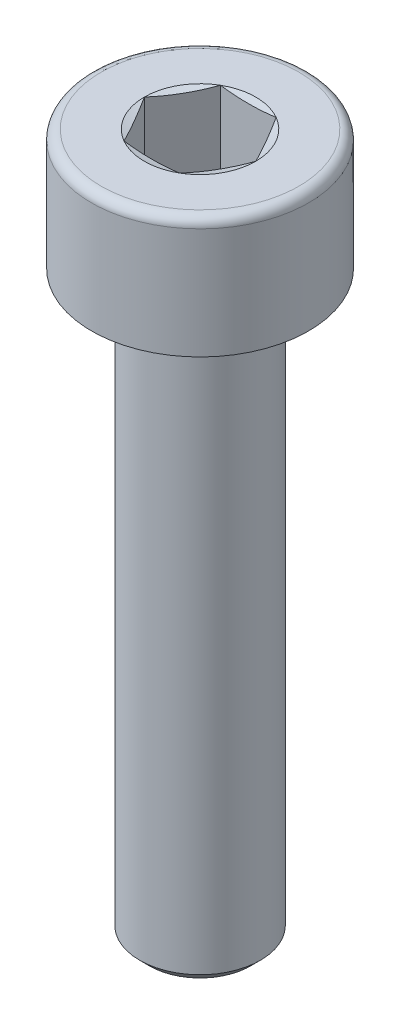
ISO-10303-21;
HEADER;
FILE_DESCRIPTION(('STEP AP214'),'2;1');
FILE_NAME('part.step','',(''),(''),'','','');
FILE_SCHEMA(('AUTOMOTIVE_DESIGN { 1 0 10303 214 1 1 1 1 }'));
ENDSEC;
DATA;
#1=APPLICATION_CONTEXT('core data for automotive mechanical design processes');
#2=APPLICATION_PROTOCOL_DEFINITION('international standard','automotive_design',2000,#1);
#3=PRODUCT_CONTEXT('',#1,'mechanical');
#4=PRODUCT('Part','Part','',(#3));
#5=PRODUCT_RELATED_PRODUCT_CATEGORY('part','',(#4));
#6=PRODUCT_DEFINITION_FORMATION('','',#4);
#7=PRODUCT_DEFINITION_CONTEXT('part definition',#1,'design');
#8=PRODUCT_DEFINITION('design','',#6,#7);
#9=PRODUCT_DEFINITION_SHAPE('','',#8);
#10=(LENGTH_UNIT() NAMED_UNIT(*) SI_UNIT(.MILLI.,.METRE.));
#11=(NAMED_UNIT(*) PLANE_ANGLE_UNIT() SI_UNIT($,.RADIAN.));
#12=(NAMED_UNIT(*) SI_UNIT($,.STERADIAN.) SOLID_ANGLE_UNIT());
#13=UNCERTAINTY_MEASURE_WITH_UNIT(LENGTH_MEASURE(1.E-05),#10,'distance_accuracy_value','');
#14=(GEOMETRIC_REPRESENTATION_CONTEXT(3) GLOBAL_UNCERTAINTY_ASSIGNED_CONTEXT((#13)) GLOBAL_UNIT_ASSIGNED_CONTEXT((#10,
#11,#12)) REPRESENTATION_CONTEXT('',''));
#15=CARTESIAN_POINT('',(0.,0.,0.));
#16=DIRECTION('',(0.,0.,1.));
#17=DIRECTION('',(1.,0.,0.));
#18=AXIS2_PLACEMENT_3D('',#15,#16,#17);
#19=CARTESIAN_POINT('',(-0.577350269189626,0.5,1.));
#20=DIRECTION('',(-0.866025403784439,0.,0.5));
#21=DIRECTION('',(0.5,0.,0.866025403784439));
#22=AXIS2_PLACEMENT_3D('',#19,#20,#21);
#23=PLANE('',#22);
#24=CARTESIAN_POINT('',(-0.577350269189626,2.5,1.));
#25=CARTESIAN_POINT('',(-0.602256905546369,2.4928156948734,0.956860440384478));
#26=CARTESIAN_POINT('',(-0.627233209396661,2.48665993251672,0.913600213130495));
#27=CARTESIAN_POINT('',(-0.677282869012062,2.47629629733561,0.826911659775093));
#28=CARTESIAN_POINT('',(-0.702356208114864,2.47208810385436,0.783483362533635));
#29=CARTESIAN_POINT('',(-0.777414647875531,2.46225168137474,0.653478331331313));
#30=CARTESIAN_POINT('',(-0.827492964204296,2.45934068378329,0.566740143092385));
#31=CARTESIAN_POINT('',(-0.923802752789168,2.46037348534467,0.399926695997169));
#32=CARTESIAN_POINT('',(-0.970035820593887,2.46381057241938,0.319848673569621));
#33=CARTESIAN_POINT('',(-1.03932177179707,2.47367744547349,0.199841885834972));
#34=CARTESIAN_POINT('',(-1.0624605054686,2.47776673103799,0.159764423493069));
#35=CARTESIAN_POINT('',(-1.10865304075022,2.48761182938245,0.079756605454884));
#36=CARTESIAN_POINT('',(-1.13170682656885,2.49336793760975,0.039826277110207));
#37=CARTESIAN_POINT('',(-1.15470053837925,2.5,0.));
#38=B_SPLINE_CURVE_WITH_KNOTS('',3,(#24,#25,#26,#27,#28,#29,#30,#31,#32,#33,#34,#35,#36,#37),
.UNSPECIFIED.,.F.,.F.,(4,2,2,2,2,2,4),(0.,0.150960283418929,0.3018957031821,0.602226966634645,
0.879613062899962,1.01895925678016,1.15833016516169),.UNSPECIFIED.);
#39=CARTESIAN_POINT('',(-0.577350269189627,2.5,0.999999999999999));
#40=VERTEX_POINT('',#39);
#41=CARTESIAN_POINT('',(-1.15470053837925,2.5,0.));
#42=VERTEX_POINT('',#41);
#43=EDGE_CURVE('E81',#40,#42,#38,.T.);
#44=ORIENTED_EDGE('',*,*,#43,.F.);
#45=DIRECTION('',(0.,1.,0.));
#46=VECTOR('',#45,1.);
#47=CARTESIAN_POINT('',(-0.577350269189626,0.5,1.));
#48=LINE('',#47,#46);
#49=CARTESIAN_POINT('',(-0.577350269189626,0.5,1.));
#50=VERTEX_POINT('',#49);
#51=EDGE_CURVE('E117',#40,#50,#48,.F.);
#52=ORIENTED_EDGE('',*,*,#51,.T.);
#53=DIRECTION('',(0.5,0.,0.866025403784439));
#54=VECTOR('',#53,1.);
#55=CARTESIAN_POINT('',(-0.577350269189626,0.5,1.));
#56=LINE('',#55,#54);
#57=CARTESIAN_POINT('',(-1.15470053837925,0.5,0.));
#58=VERTEX_POINT('',#57);
#59=EDGE_CURVE('E90',#58,#50,#56,.T.);
#60=ORIENTED_EDGE('',*,*,#59,.F.);
#61=DIRECTION('',(0.,1.,0.));
#62=VECTOR('',#61,1.);
#63=CARTESIAN_POINT('',(-1.15470053837925,0.5,0.));
#64=LINE('',#63,#62);
#65=EDGE_CURVE('E89',#58,#42,#64,.T.);
#66=ORIENTED_EDGE('',*,*,#65,.T.);
#67=EDGE_LOOP('',(#44,#52,#60,#66));
#68=FACE_BOUND('',#67,.T.);
#69=ADVANCED_FACE('F17',(#68),#23,.F.);
#70=CARTESIAN_POINT('',(-1.15470053837925,0.5,0.));
#71=DIRECTION('',(-0.866025403784439,0.,-0.5));
#72=DIRECTION('',(-0.5,0.,0.866025403784439));
#73=AXIS2_PLACEMENT_3D('',#70,#71,#72);
#74=PLANE('',#73);
#75=CARTESIAN_POINT('',(-1.15470053837925,2.5,0.));
#76=CARTESIAN_POINT('',(-1.12979390202251,2.4928156948734,-0.0431395596155219));
#77=CARTESIAN_POINT('',(-1.10481759817222,2.48665993251672,-0.0863997868695049));
#78=CARTESIAN_POINT('',(-1.05476793855682,2.47629629733561,-0.173088340224907));
#79=CARTESIAN_POINT('',(-1.02969459945401,2.47208810385436,-0.216516637466365));
#80=CARTESIAN_POINT('',(-0.954636159693347,2.46225168137474,-0.346521668668687));
#81=CARTESIAN_POINT('',(-0.904557843364581,2.45934068378329,-0.433259856907615));
#82=CARTESIAN_POINT('',(-0.808248054779709,2.46037348534467,-0.600073304002831));
#83=CARTESIAN_POINT('',(-0.762014986974991,2.46381057241938,-0.68015132643038));
#84=CARTESIAN_POINT('',(-0.692729035771809,2.47367744547349,-0.800158114165029));
#85=CARTESIAN_POINT('',(-0.669590302100274,2.47776673103799,-0.840235576506932));
#86=CARTESIAN_POINT('',(-0.623397766818654,2.48761182938245,-0.920243394545117));
#87=CARTESIAN_POINT('',(-0.600343981000024,2.49336793760975,-0.960173722889794));
#88=CARTESIAN_POINT('',(-0.577350269189626,2.5,-1.));
#89=B_SPLINE_CURVE_WITH_KNOTS('',3,(#75,#76,#77,#78,#79,#80,#81,#82,#83,#84,#85,#86,#87,#88),
.UNSPECIFIED.,.F.,.F.,(4,2,2,2,2,2,4),(0.,0.150960283418929,0.3018957031821,0.602226966634645,
0.879613062899963,1.01895925678016,1.15833016516169),.UNSPECIFIED.);
#90=CARTESIAN_POINT('',(-0.577350269189624,2.5,-1.));
#91=VERTEX_POINT('',#90);
#92=EDGE_CURVE('E96',#42,#91,#89,.T.);
#93=ORIENTED_EDGE('',*,*,#92,.F.);
#94=ORIENTED_EDGE('',*,*,#65,.F.);
#95=DIRECTION('',(0.5,0.,-0.866025403784439));
#96=VECTOR('',#95,1.);
#97=CARTESIAN_POINT('',(-1.15470053837925,0.5,0.));
#98=LINE('',#97,#96);
#99=CARTESIAN_POINT('',(-0.577350269189626,0.5,-1.));
#100=VERTEX_POINT('',#99);
#101=EDGE_CURVE('E228',#58,#100,#98,.T.);
#102=ORIENTED_EDGE('',*,*,#101,.T.);
#103=DIRECTION('',(0.,1.,0.));
#104=VECTOR('',#103,1.);
#105=CARTESIAN_POINT('',(-0.577350269189626,0.5,-1.));
#106=LINE('',#105,#104);
#107=EDGE_CURVE('E115',#100,#91,#106,.T.);
#108=ORIENTED_EDGE('',*,*,#107,.T.);
#109=EDGE_LOOP('',(#93,#94,#102,#108));
#110=FACE_BOUND('',#109,.T.);
#111=ADVANCED_FACE('F113',(#110),#74,.F.);
#112=CARTESIAN_POINT('',(0.577350269189626,0.5,1.));
#113=DIRECTION('',(0.,0.,1.));
#114=DIRECTION('',(1.,0.,0.));
#115=AXIS2_PLACEMENT_3D('',#112,#113,#114);
#116=PLANE('',#115);
#117=CARTESIAN_POINT('',(0.577350269189626,2.5,0.999999999999999));
#118=CARTESIAN_POINT('',(0.527536996476139,2.4928156948734,1.));
#119=CARTESIAN_POINT('',(0.477584388775556,2.48665993251672,1.));
#120=CARTESIAN_POINT('',(0.377485069544755,2.47629629733561,1.));
#121=CARTESIAN_POINT('',(0.327338391339149,2.47208810385436,1.));
#122=CARTESIAN_POINT('',(0.177221511817816,2.46225168137474,1.));
#123=CARTESIAN_POINT('',(0.0770648791602852,2.45934068378329,1.));
#124=CARTESIAN_POINT('',(-0.115554698009459,2.46037348534467,1.));
#125=CARTESIAN_POINT('',(-0.208020833618895,2.46381057241938,1.));
#126=CARTESIAN_POINT('',(-0.346592736025259,2.47367744547349,1.));
#127=CARTESIAN_POINT('',(-0.39287020336833,2.47776673103799,1.));
#128=CARTESIAN_POINT('',(-0.485255273931571,2.48761182938245,1.));
#129=CARTESIAN_POINT('',(-0.53136284556883,2.49336793760975,1.));
#130=CARTESIAN_POINT('',(-0.577350269189626,2.5,1.));
#131=B_SPLINE_CURVE_WITH_KNOTS('',3,(#117,#118,#119,#120,#121,#122,#123,#124,#125,#126,#127,
#128,#129,#130),.UNSPECIFIED.,.F.,.F.,(4,2,2,2,2,2,4),(0.,0.150960283418929,0.3018957031821,
0.602226966634645,0.879613062899963,1.01895925678016,1.15833016516169),.UNSPECIFIED.);
#132=CARTESIAN_POINT('',(0.577350269189624,2.5,1.));
#133=VERTEX_POINT('',#132);
#134=EDGE_CURVE('E75',#133,#40,#131,.T.);
#135=ORIENTED_EDGE('',*,*,#134,.F.);
#136=DIRECTION('',(0.,1.,0.));
#137=VECTOR('',#136,1.);
#138=CARTESIAN_POINT('',(0.577350269189626,0.5,1.));
#139=LINE('',#138,#137);
#140=CARTESIAN_POINT('',(0.577350269189626,0.5,1.));
#141=VERTEX_POINT('',#140);
#142=EDGE_CURVE('E211',#133,#141,#139,.F.);
#143=ORIENTED_EDGE('',*,*,#142,.T.);
#144=DIRECTION('',(1.,0.,0.));
#145=VECTOR('',#144,1.);
#146=CARTESIAN_POINT('',(-0.577350269189626,0.5,1.));
#147=LINE('',#146,#145);
#148=EDGE_CURVE('E232',#141,#50,#147,.F.);
#149=ORIENTED_EDGE('',*,*,#148,.T.);
#150=ORIENTED_EDGE('',*,*,#51,.F.);
#151=EDGE_LOOP('',(#135,#143,#149,#150));
#152=FACE_BOUND('',#151,.T.);
#153=ADVANCED_FACE('F138',(#152),#116,.F.);
#154=CARTESIAN_POINT('',(-0.577350269189626,0.5,-1.));
#155=DIRECTION('',(0.,-1.,0.));
#156=DIRECTION('',(0.,0.,-1.));
#157=AXIS2_PLACEMENT_3D('',#154,#155,#156);
#158=PLANE('',#157);
#159=ORIENTED_EDGE('',*,*,#59,.T.);
#160=ORIENTED_EDGE('',*,*,#148,.F.);
#161=DIRECTION('',(0.5,0.,-0.866025403784439));
#162=VECTOR('',#161,1.);
#163=CARTESIAN_POINT('',(1.15470053837925,0.5,0.));
#164=LINE('',#163,#162);
#165=CARTESIAN_POINT('',(1.15470053837925,0.5,0.));
#166=VERTEX_POINT('',#165);
#167=EDGE_CURVE('E160',#141,#166,#164,.T.);
#168=ORIENTED_EDGE('',*,*,#167,.T.);
#169=DIRECTION('',(-0.5,0.,-0.866025403784439));
#170=VECTOR('',#169,1.);
#171=CARTESIAN_POINT('',(0.577350269189626,0.5,-1.));
#172=LINE('',#171,#170);
#173=CARTESIAN_POINT('',(0.577350269189626,0.5,-1.));
#174=VERTEX_POINT('',#173);
#175=EDGE_CURVE('E208',#166,#174,#172,.T.);
#176=ORIENTED_EDGE('',*,*,#175,.T.);
#177=DIRECTION('',(-1.,0.,0.));
#178=VECTOR('',#177,1.);
#179=CARTESIAN_POINT('',(-0.577350269189626,0.5,-1.));
#180=LINE('',#179,#178);
#181=EDGE_CURVE('E223',#174,#100,#180,.T.);
#182=ORIENTED_EDGE('',*,*,#181,.T.);
#183=ORIENTED_EDGE('',*,*,#101,.F.);
#184=EDGE_LOOP('',(#159,#160,#168,#176,#182,#183));
#185=FACE_BOUND('',#184,.T.);
#186=ADVANCED_FACE('F142',(#185),#158,.F.);
#187=CARTESIAN_POINT('',(-0.577350269189626,0.5,-1.));
#188=DIRECTION('',(0.,0.,-1.));
#189=DIRECTION('',(-1.,0.,0.));
#190=AXIS2_PLACEMENT_3D('',#187,#188,#189);
#191=PLANE('',#190);
#192=CARTESIAN_POINT('',(-0.577350269189626,2.5,-1.));
#193=CARTESIAN_POINT('',(-0.527536996476139,2.4928156948734,-1.));
#194=CARTESIAN_POINT('',(-0.477584388775556,2.48665993251672,-1.));
#195=CARTESIAN_POINT('',(-0.377485069544755,2.47629629733561,-1.));
#196=CARTESIAN_POINT('',(-0.327338391339149,2.47208810385436,-1.));
#197=CARTESIAN_POINT('',(-0.177221511817817,2.46225168137474,-1.));
#198=CARTESIAN_POINT('',(-0.0770648791602854,2.45934068378329,-1.));
#199=CARTESIAN_POINT('',(0.115554698009459,2.46037348534467,-1.));
#200=CARTESIAN_POINT('',(0.208020833618895,2.46381057241938,-1.));
#201=CARTESIAN_POINT('',(0.346592736025259,2.47367744547349,-1.));
#202=CARTESIAN_POINT('',(0.39287020336833,2.47776673103799,-1.));
#203=CARTESIAN_POINT('',(0.485255273931571,2.48761182938245,-1.));
#204=CARTESIAN_POINT('',(0.53136284556883,2.49336793760975,-1.));
#205=CARTESIAN_POINT('',(0.577350269189627,2.5,-1.));
#206=B_SPLINE_CURVE_WITH_KNOTS('',3,(#192,#193,#194,#195,#196,#197,#198,#199,#200,#201,#202,
#203,#204,#205),.UNSPECIFIED.,.F.,.F.,(4,2,2,2,2,2,4),(0.,0.150960283418929,0.301895703182099,
0.602226966634645,0.879613062899963,1.01895925678016,1.15833016516169),.UNSPECIFIED.);
#207=CARTESIAN_POINT('',(0.577350269189626,2.5,-0.999999999999999));
#208=VERTEX_POINT('',#207);
#209=EDGE_CURVE('E155',#91,#208,#206,.T.);
#210=ORIENTED_EDGE('',*,*,#209,.F.);
#211=ORIENTED_EDGE('',*,*,#107,.F.);
#212=ORIENTED_EDGE('',*,*,#181,.F.);
#213=DIRECTION('',(0.,1.,0.));
#214=VECTOR('',#213,1.);
#215=CARTESIAN_POINT('',(0.577350269189626,0.5,-1.));
#216=LINE('',#215,#214);
#217=EDGE_CURVE('E203',#174,#208,#216,.T.);
#218=ORIENTED_EDGE('',*,*,#217,.T.);
#219=EDGE_LOOP('',(#210,#211,#212,#218));
#220=FACE_BOUND('',#219,.T.);
#221=ADVANCED_FACE('F146',(#220),#191,.F.);
#222=CARTESIAN_POINT('',(1.15470053837925,0.5,0.));
#223=DIRECTION('',(0.866025403784439,0.,0.5));
#224=DIRECTION('',(0.5,0.,-0.866025403784439));
#225=AXIS2_PLACEMENT_3D('',#222,#223,#224);
#226=PLANE('',#225);
#227=CARTESIAN_POINT('',(1.15470053837925,2.5,0.));
#228=CARTESIAN_POINT('',(1.12979390202251,2.4928156948734,0.043139559615522));
#229=CARTESIAN_POINT('',(1.10481759817222,2.48665993251672,0.0863997868695051));
#230=CARTESIAN_POINT('',(1.05476793855682,2.47629629733561,0.173088340224907));
#231=CARTESIAN_POINT('',(1.02969459945401,2.47208810385436,0.216516637466365));
#232=CARTESIAN_POINT('',(0.954636159693347,2.46225168137474,0.346521668668687));
#233=CARTESIAN_POINT('',(0.904557843364581,2.45934068378329,0.433259856907615));
#234=CARTESIAN_POINT('',(0.808248054779709,2.46037348534467,0.600073304002831));
#235=CARTESIAN_POINT('',(0.762014986974991,2.46381057241938,0.680151326430379));
#236=CARTESIAN_POINT('',(0.692729035771809,2.47367744547349,0.800158114165028));
#237=CARTESIAN_POINT('',(0.669590302100274,2.47776673103799,0.840235576506932));
#238=CARTESIAN_POINT('',(0.623397766818654,2.48761182938245,0.920243394545116));
#239=CARTESIAN_POINT('',(0.600343981000024,2.49336793760975,0.960173722889794));
#240=CARTESIAN_POINT('',(0.577350269189626,2.5,1.));
#241=B_SPLINE_CURVE_WITH_KNOTS('',3,(#227,#228,#229,#230,#231,#232,#233,#234,#235,#236,#237,
#238,#239,#240),.UNSPECIFIED.,.F.,.F.,(4,2,2,2,2,2,4),(0.,0.150960283418929,0.3018957031821,
0.602226966634645,0.879613062899962,1.01895925678016,1.15833016516169),.UNSPECIFIED.);
#242=CARTESIAN_POINT('',(1.15470053837925,2.5,0.));
#243=VERTEX_POINT('',#242);
#244=EDGE_CURVE('E161',#243,#133,#241,.T.);
#245=ORIENTED_EDGE('',*,*,#244,.F.);
#246=DIRECTION('',(0.,1.,0.));
#247=VECTOR('',#246,1.);
#248=CARTESIAN_POINT('',(1.15470053837925,0.5,0.));
#249=LINE('',#248,#247);
#250=EDGE_CURVE('E199',#243,#166,#249,.F.);
#251=ORIENTED_EDGE('',*,*,#250,.T.);
#252=ORIENTED_EDGE('',*,*,#167,.F.);
#253=ORIENTED_EDGE('',*,*,#142,.F.);
#254=EDGE_LOOP('',(#245,#251,#252,#253));
#255=FACE_BOUND('',#254,.T.);
#256=ADVANCED_FACE('F151',(#255),#226,.F.);
#257=CARTESIAN_POINT('',(0.577350269189626,0.5,-1.));
#258=DIRECTION('',(0.866025403784439,0.,-0.5));
#259=DIRECTION('',(-0.5,0.,-0.866025403784439));
#260=AXIS2_PLACEMENT_3D('',#257,#258,#259);
#261=PLANE('',#260);
#262=CARTESIAN_POINT('',(1.15470053837925,2.5,0.));
#263=CARTESIAN_POINT('',(1.12979390202251,2.4928156948734,-0.0431395596155215));
#264=CARTESIAN_POINT('',(1.10481759817222,2.48665993251672,-0.0863997868695045));
#265=CARTESIAN_POINT('',(1.05476793855682,2.47629629733561,-0.173088340224907));
#266=CARTESIAN_POINT('',(1.02969459945401,2.47208810385436,-0.216516637466365));
#267=CARTESIAN_POINT('',(0.954636159693347,2.46225168137474,-0.346521668668687));
#268=CARTESIAN_POINT('',(0.904557843364581,2.45934068378329,-0.433259856907614));
#269=CARTESIAN_POINT('',(0.808248054779709,2.46037348534467,-0.60007330400283));
#270=CARTESIAN_POINT('',(0.762014986974991,2.46381057241937,-0.680151326430379));
#271=CARTESIAN_POINT('',(0.69272903577181,2.47367744547348,-0.800158114165028));
#272=CARTESIAN_POINT('',(0.669590302100275,2.47776673103799,-0.840235576506931));
#273=CARTESIAN_POINT('',(0.623397766818654,2.48761182938245,-0.920243394545116));
#274=CARTESIAN_POINT('',(0.600343981000025,2.49336793760975,-0.960173722889793));
#275=CARTESIAN_POINT('',(0.577350269189626,2.5,-0.999999999999999));
#276=B_SPLINE_CURVE_WITH_KNOTS('',3,(#262,#263,#264,#265,#266,#267,#268,#269,#270,#271,#272,
#273,#274,#275),.UNSPECIFIED.,.F.,.F.,(4,2,2,2,2,2,4),(0.,0.150960283418929,0.3018957031821,
0.602226966634646,0.879613062899962,1.01895925678016,1.15833016516169),.UNSPECIFIED.);
#277=EDGE_CURVE('E202',#243,#208,#276,.T.);
#278=ORIENTED_EDGE('',*,*,#277,.T.);
#279=ORIENTED_EDGE('',*,*,#217,.F.);
#280=ORIENTED_EDGE('',*,*,#175,.F.);
#281=ORIENTED_EDGE('',*,*,#250,.F.);
#282=EDGE_LOOP('',(#278,#279,#280,#281));
#283=FACE_BOUND('',#282,.T.);
#284=ADVANCED_FACE('F194',(#283),#261,.F.);
#285=CARTESIAN_POINT('',(-0.323386652483568,5.38251924939228,0.));
#286=DIRECTION('',(0.,0.,1.));
#287=DIRECTION('',(-1.,0.,0.));
#288=AXIS2_PLACEMENT_3D('',#285,#286,#287);
#289=CIRCLE('',#288,3.);
#290=TRIMMED_CURVE('',#289,(PARAMETER_VALUE(-1.67880173874616)),
(PARAMETER_VALUE(1.67880173874616)),.T.,.PARAMETER.);
#291=CARTESIAN_POINT('',(0.,5.38251924939228,0.));
#292=DIRECTION('',(0.,1.,0.));
#293=AXIS1_PLACEMENT('',#291,#292);
#294=SURFACE_OF_REVOLUTION('',#290,#293);
#295=ORIENTED_EDGE('',*,*,#244,.T.);
#296=CARTESIAN_POINT('',(0.,2.5,0.));
#297=DIRECTION('',(0.,1.,0.));
#298=DIRECTION('',(-1.,0.,0.));
#299=AXIS2_PLACEMENT_3D('',#296,#297,#298);
#300=CIRCLE('',#299,1.15470053837925);
#301=EDGE_CURVE('E259',#243,#133,#300,.F.);
#302=ORIENTED_EDGE('',*,*,#301,.F.);
#303=EDGE_LOOP('',(#295,#302));
#304=FACE_BOUND('',#303,.T.);
#305=ADVANCED_FACE('F191',(#304),#294,.T.);
#306=CARTESIAN_POINT('',(-0.323386652483568,5.38251924939228,0.));
#307=DIRECTION('',(0.,0.,1.));
#308=DIRECTION('',(-1.,0.,0.));
#309=AXIS2_PLACEMENT_3D('',#306,#307,#308);
#310=CIRCLE('',#309,3.);
#311=TRIMMED_CURVE('',#310,(PARAMETER_VALUE(-1.67880173874616)),
(PARAMETER_VALUE(1.67880173874616)),.T.,.PARAMETER.);
#312=CARTESIAN_POINT('',(0.,5.38251924939228,0.));
#313=DIRECTION('',(0.,1.,0.));
#314=AXIS1_PLACEMENT('',#312,#313);
#315=SURFACE_OF_REVOLUTION('',#311,#314);
#316=ORIENTED_EDGE('',*,*,#134,.T.);
#317=CARTESIAN_POINT('',(0.,2.5,0.));
#318=DIRECTION('',(0.,1.,0.));
#319=DIRECTION('',(-1.,0.,0.));
#320=AXIS2_PLACEMENT_3D('',#317,#318,#319);
#321=CIRCLE('',#320,1.15470053837925);
#322=EDGE_CURVE('E106',#133,#40,#321,.F.);
#323=ORIENTED_EDGE('',*,*,#322,.F.);
#324=EDGE_LOOP('',(#316,#323));
#325=FACE_BOUND('',#324,.T.);
#326=ADVANCED_FACE('F188',(#325),#315,.T.);
#327=CARTESIAN_POINT('',(-0.323386652483568,5.38251924939228,0.));
#328=DIRECTION('',(0.,0.,1.));
#329=DIRECTION('',(-1.,0.,0.));
#330=AXIS2_PLACEMENT_3D('',#327,#328,#329);
#331=CIRCLE('',#330,3.);
#332=TRIMMED_CURVE('',#331,(PARAMETER_VALUE(-1.67880173874616)),
(PARAMETER_VALUE(1.67880173874616)),.T.,.PARAMETER.);
#333=CARTESIAN_POINT('',(0.,5.38251924939228,0.));
#334=DIRECTION('',(0.,1.,0.));
#335=AXIS1_PLACEMENT('',#333,#334);
#336=SURFACE_OF_REVOLUTION('',#332,#335);
#337=ORIENTED_EDGE('',*,*,#43,.T.);
#338=CARTESIAN_POINT('',(0.,2.5,0.));
#339=DIRECTION('',(0.,1.,0.));
#340=DIRECTION('',(-1.,0.,0.));
#341=AXIS2_PLACEMENT_3D('',#338,#339,#340);
#342=CIRCLE('',#341,1.15470053837925);
#343=EDGE_CURVE('E85',#40,#42,#342,.F.);
#344=ORIENTED_EDGE('',*,*,#343,.F.);
#345=EDGE_LOOP('',(#337,#344));
#346=FACE_BOUND('',#345,.T.);
#347=ADVANCED_FACE('F83',(#346),#336,.T.);
#348=CARTESIAN_POINT('',(-0.323386652483568,5.38251924939228,0.));
#349=DIRECTION('',(0.,0.,1.));
#350=DIRECTION('',(-1.,0.,0.));
#351=AXIS2_PLACEMENT_3D('',#348,#349,#350);
#352=CIRCLE('',#351,3.);
#353=TRIMMED_CURVE('',#352,(PARAMETER_VALUE(-1.67880173874616)),
(PARAMETER_VALUE(1.67880173874616)),.T.,.PARAMETER.);
#354=CARTESIAN_POINT('',(0.,5.38251924939228,0.));
#355=DIRECTION('',(0.,1.,0.));
#356=AXIS1_PLACEMENT('',#354,#355);
#357=SURFACE_OF_REVOLUTION('',#353,#356);
#358=ORIENTED_EDGE('',*,*,#92,.T.);
#359=CARTESIAN_POINT('',(0.,2.5,0.));
#360=DIRECTION('',(0.,1.,0.));
#361=DIRECTION('',(-1.,0.,0.));
#362=AXIS2_PLACEMENT_3D('',#359,#360,#361);
#363=CIRCLE('',#362,1.15470053837925);
#364=EDGE_CURVE('E103',#42,#91,#363,.F.);
#365=ORIENTED_EDGE('',*,*,#364,.F.);
#366=EDGE_LOOP('',(#358,#365));
#367=FACE_BOUND('',#366,.T.);
#368=ADVANCED_FACE('F109',(#367),#357,.T.);
#369=CARTESIAN_POINT('',(-0.323386652483568,5.38251924939228,0.));
#370=DIRECTION('',(0.,0.,1.));
#371=DIRECTION('',(-1.,0.,0.));
#372=AXIS2_PLACEMENT_3D('',#369,#370,#371);
#373=CIRCLE('',#372,3.);
#374=TRIMMED_CURVE('',#373,(PARAMETER_VALUE(-1.67880173874616)),
(PARAMETER_VALUE(1.67880173874616)),.T.,.PARAMETER.);
#375=CARTESIAN_POINT('',(0.,5.38251924939228,0.));
#376=DIRECTION('',(0.,1.,0.));
#377=AXIS1_PLACEMENT('',#375,#376);
#378=SURFACE_OF_REVOLUTION('',#374,#377);
#379=ORIENTED_EDGE('',*,*,#209,.T.);
#380=CARTESIAN_POINT('',(0.,2.5,0.));
#381=DIRECTION('',(0.,1.,0.));
#382=DIRECTION('',(-1.,0.,0.));
#383=AXIS2_PLACEMENT_3D('',#380,#381,#382);
#384=CIRCLE('',#383,1.15470053837925);
#385=EDGE_CURVE('E111',#91,#208,#384,.F.);
#386=ORIENTED_EDGE('',*,*,#385,.F.);
#387=EDGE_LOOP('',(#379,#386));
#388=FACE_BOUND('',#387,.T.);
#389=ADVANCED_FACE('F167',(#388),#378,.T.);
#390=CARTESIAN_POINT('',(-0.323386652483568,5.38251924939228,0.));
#391=DIRECTION('',(0.,0.,1.));
#392=DIRECTION('',(-1.,0.,0.));
#393=AXIS2_PLACEMENT_3D('',#390,#391,#392);
#394=CIRCLE('',#393,3.);
#395=TRIMMED_CURVE('',#394,(PARAMETER_VALUE(-1.67880173874616)),
(PARAMETER_VALUE(1.67880173874616)),.T.,.PARAMETER.);
#396=CARTESIAN_POINT('',(0.,5.38251924939228,0.));
#397=DIRECTION('',(0.,1.,0.));
#398=AXIS1_PLACEMENT('',#396,#397);
#399=SURFACE_OF_REVOLUTION('',#395,#398);
#400=ORIENTED_EDGE('',*,*,#277,.F.);
#401=CARTESIAN_POINT('',(0.,2.5,0.));
#402=DIRECTION('',(0.,1.,0.));
#403=DIRECTION('',(-1.,0.,0.));
#404=AXIS2_PLACEMENT_3D('',#401,#402,#403);
#405=CIRCLE('',#404,1.15470053837925);
#406=EDGE_CURVE('E254',#208,#243,#405,.F.);
#407=ORIENTED_EDGE('',*,*,#406,.F.);
#408=EDGE_LOOP('',(#400,#407));
#409=FACE_BOUND('',#408,.T.);
#410=ADVANCED_FACE('F172',(#409),#399,.T.);
#411=CARTESIAN_POINT('',(0.,2.5,0.));
#412=DIRECTION('',(0.,1.,0.));
#413=DIRECTION('',(0.,0.,1.));
#414=AXIS2_PLACEMENT_3D('',#411,#412,#413);
#415=PLANE('',#414);
#416=CARTESIAN_POINT('',(0.,2.5,0.));
#417=DIRECTION('',(0.,-1.,0.));
#418=DIRECTION('',(0.,0.,-1.));
#419=AXIS2_PLACEMENT_3D('',#416,#417,#418);
#420=CIRCLE('',#419,2.05);
#421=CARTESIAN_POINT('',(0.,2.5,-2.05));
#422=VERTEX_POINT('',#421);
#423=CARTESIAN_POINT('',(0.,2.5,2.05));
#424=VERTEX_POINT('',#423);
#425=EDGE_CURVE('E37',#422,#424,#420,.T.);
#426=ORIENTED_EDGE('',*,*,#425,.F.);
#427=CARTESIAN_POINT('',(0.,2.5,0.));
#428=DIRECTION('',(0.,-1.,0.));
#429=DIRECTION('',(0.,0.,1.));
#430=AXIS2_PLACEMENT_3D('',#427,#428,#429);
#431=CIRCLE('',#430,2.05);
#432=EDGE_CURVE('E327',#424,#422,#431,.T.);
#433=ORIENTED_EDGE('',*,*,#432,.F.);
#434=EDGE_LOOP('',(#426,#433));
#435=FACE_BOUND('',#434,.T.);
#436=ORIENTED_EDGE('',*,*,#385,.T.);
#437=ORIENTED_EDGE('',*,*,#406,.T.);
#438=ORIENTED_EDGE('',*,*,#301,.T.);
#439=ORIENTED_EDGE('',*,*,#322,.T.);
#440=ORIENTED_EDGE('',*,*,#343,.T.);
#441=ORIENTED_EDGE('',*,*,#364,.T.);
#442=EDGE_LOOP('',(#436,#437,#438,#439,#440,#441));
#443=FACE_BOUND('',#442,.T.);
#444=ADVANCED_FACE('F102',(#435,#443),#415,.T.);
#445=CARTESIAN_POINT('',(0.,2.3,0.));
#446=DIRECTION('',(0.,1.,0.));
#447=DIRECTION('',(0.,0.,1.));
#448=AXIS2_PLACEMENT_3D('',#445,#446,#447);
#449=TOROIDAL_SURFACE('',#448,2.05,0.2);
#450=CARTESIAN_POINT('',(0.,2.3,0.));
#451=DIRECTION('',(0.,-1.,0.));
#452=DIRECTION('',(0.,0.,-1.));
#453=AXIS2_PLACEMENT_3D('',#450,#451,#452);
#454=CIRCLE('',#453,2.25);
#455=CARTESIAN_POINT('',(0.,2.3,-2.25));
#456=VERTEX_POINT('',#455);
#457=EDGE_CURVE('E253',#456,#456,#454,.T.);
#458=ORIENTED_EDGE('',*,*,#457,.F.);
#459=EDGE_LOOP('',(#458));
#460=FACE_BOUND('',#459,.T.);
#461=ORIENTED_EDGE('',*,*,#432,.T.);
#462=ORIENTED_EDGE('',*,*,#425,.T.);
#463=EDGE_LOOP('',(#461,#462));
#464=FACE_BOUND('',#463,.T.);
#465=ADVANCED_FACE('F304',(#460,#464),#449,.T.);
#466=CARTESIAN_POINT('',(0.,-12.,0.));
#467=DIRECTION('',(0.,-1.,0.));
#468=DIRECTION('',(0.,0.,-1.));
#469=AXIS2_PLACEMENT_3D('',#466,#467,#468);
#470=PLANE('',#469);
#471=CARTESIAN_POINT('',(0.,-12.0000000000005,0.));
#472=DIRECTION('',(0.,1.,0.));
#473=DIRECTION('',(0.,0.,1.));
#474=AXIS2_PLACEMENT_3D('',#471,#472,#473);
#475=CIRCLE('',#474,1.0499999999638);
#476=CARTESIAN_POINT('',(0.,-12.0000000000005,1.0499999999638));
#477=VERTEX_POINT('',#476);
#478=EDGE_CURVE('E250',#477,#477,#475,.T.);
#479=ORIENTED_EDGE('',*,*,#478,.F.);
#480=EDGE_LOOP('',(#479));
#481=FACE_BOUND('',#480,.T.);
#482=ADVANCED_FACE('F301',(#481),#470,.T.);
#483=CARTESIAN_POINT('',(0.,2.5,0.));
#484=DIRECTION('',(0.,-1.,0.));
#485=DIRECTION('',(0.,0.,-1.));
#486=AXIS2_PLACEMENT_3D('',#483,#484,#485);
#487=CYLINDRICAL_SURFACE('',#486,2.25);
#488=ORIENTED_EDGE('',*,*,#457,.T.);
#489=EDGE_LOOP('',(#488));
#490=FACE_BOUND('',#489,.T.);
#491=CARTESIAN_POINT('',(0.,0.,0.));
#492=DIRECTION('',(0.,-1.,0.));
#493=DIRECTION('',(0.,0.,-1.));
#494=AXIS2_PLACEMENT_3D('',#491,#492,#493);
#495=CIRCLE('',#494,2.25);
#496=CARTESIAN_POINT('',(0.,0.,-2.25));
#497=VERTEX_POINT('',#496);
#498=EDGE_CURVE('E247',#497,#497,#495,.F.);
#499=ORIENTED_EDGE('',*,*,#498,.T.);
#500=EDGE_LOOP('',(#499));
#501=FACE_BOUND('',#500,.T.);
#502=ADVANCED_FACE('F297',(#490,#501),#487,.T.);
#503=CARTESIAN_POINT('',(0.,-11.799999999937,0.));
#504=DIRECTION('',(0.,1.,0.));
#505=DIRECTION('',(0.,0.,1.));
#506=AXIS2_PLACEMENT_3D('',#503,#504,#505);
#507=CONICAL_SURFACE('',#506,1.25000000008413,0.785398163539557);
#508=CARTESIAN_POINT('',(0.,-11.8,0.));
#509=DIRECTION('',(0.,1.,0.));
#510=DIRECTION('',(0.,0.,1.));
#511=AXIS2_PLACEMENT_3D('',#508,#509,#510);
#512=CIRCLE('',#511,1.25);
#513=CARTESIAN_POINT('',(0.,-11.8,1.25));
#514=VERTEX_POINT('',#513);
#515=EDGE_CURVE('E29',#514,#514,#512,.T.);
#516=ORIENTED_EDGE('',*,*,#515,.F.);
#517=EDGE_LOOP('',(#516));
#518=FACE_BOUND('',#517,.T.);
#519=ORIENTED_EDGE('',*,*,#478,.T.);
#520=EDGE_LOOP('',(#519));
#521=FACE_BOUND('',#520,.T.);
#522=ADVANCED_FACE('F290',(#518,#521),#507,.T.);
#523=CARTESIAN_POINT('',(0.,0.,0.));
#524=DIRECTION('',(0.,1.,0.));
#525=DIRECTION('',(0.,0.,1.));
#526=AXIS2_PLACEMENT_3D('',#523,#524,#525);
#527=PLANE('',#526);
#528=CARTESIAN_POINT('',(0.,0.,0.));
#529=DIRECTION('',(0.,1.,0.));
#530=DIRECTION('',(0.,0.,1.));
#531=AXIS2_PLACEMENT_3D('',#528,#529,#530);
#532=CIRCLE('',#531,1.25);
#533=CARTESIAN_POINT('',(0.,0.,1.25));
#534=VERTEX_POINT('',#533);
#535=EDGE_CURVE('E11',#534,#534,#532,.F.);
#536=ORIENTED_EDGE('',*,*,#535,.F.);
#537=EDGE_LOOP('',(#536));
#538=FACE_BOUND('',#537,.T.);
#539=ORIENTED_EDGE('',*,*,#498,.F.);
#540=EDGE_LOOP('',(#539));
#541=FACE_BOUND('',#540,.T.);
#542=ADVANCED_FACE('F284',(#538,#541),#527,.F.);
#543=CARTESIAN_POINT('',(0.,-12.,0.));
#544=DIRECTION('',(0.,1.,0.));
#545=DIRECTION('',(0.,0.,1.));
#546=AXIS2_PLACEMENT_3D('',#543,#544,#545);
#547=CYLINDRICAL_SURFACE('',#546,1.25);
#548=ORIENTED_EDGE('',*,*,#535,.T.);
#549=EDGE_LOOP('',(#548));
#550=FACE_BOUND('',#549,.T.);
#551=ORIENTED_EDGE('',*,*,#515,.T.);
#552=EDGE_LOOP('',(#551));
#553=FACE_BOUND('',#552,.T.);
#554=ADVANCED_FACE('F282',(#550,#553),#547,.T.);
#555=CLOSED_SHELL('',(#69,#111,#153,#186,#221,#256,#284,#305,#326,#347,#368,#389,#410,#444,#465,
#482,#502,#522,#542,#554));
#556=MANIFOLD_SOLID_BREP('B1',#555);
#557=ADVANCED_BREP_SHAPE_REPRESENTATION('',(#18,#556),#14);
#558=SHAPE_DEFINITION_REPRESENTATION(#9,#557);
ENDSEC;
END-ISO-10303-21;
